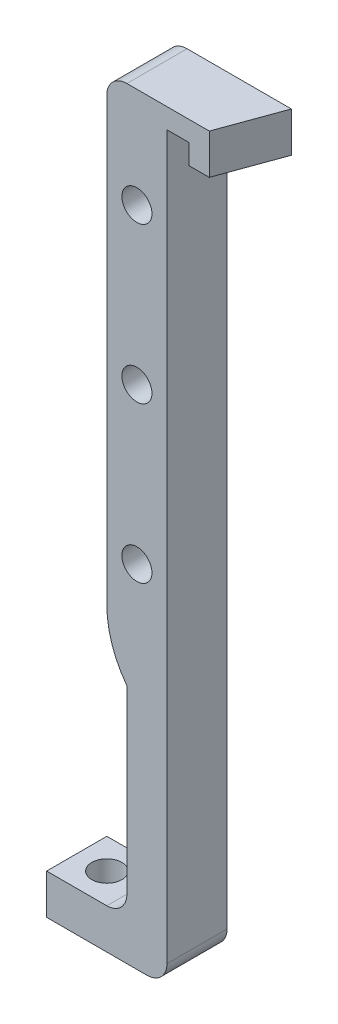
ISO-10303-21;
HEADER;
FILE_DESCRIPTION(('STEP AP214'),'2;1');
FILE_NAME('part.step','',(''),(''),'','','');
FILE_SCHEMA(('AUTOMOTIVE_DESIGN { 1 0 10303 214 1 1 1 1 }'));
ENDSEC;
DATA;
#1=APPLICATION_CONTEXT('core data for automotive mechanical design processes');
#2=APPLICATION_PROTOCOL_DEFINITION('international standard','automotive_design',2000,#1);
#3=PRODUCT_CONTEXT('',#1,'mechanical');
#4=PRODUCT('Part','Part','',(#3));
#5=PRODUCT_RELATED_PRODUCT_CATEGORY('part','',(#4));
#6=PRODUCT_DEFINITION_FORMATION('','',#4);
#7=PRODUCT_DEFINITION_CONTEXT('part definition',#1,'design');
#8=PRODUCT_DEFINITION('design','',#6,#7);
#9=PRODUCT_DEFINITION_SHAPE('','',#8);
#10=(LENGTH_UNIT() NAMED_UNIT(*) SI_UNIT(.MILLI.,.METRE.));
#11=(NAMED_UNIT(*) PLANE_ANGLE_UNIT() SI_UNIT($,.RADIAN.));
#12=(NAMED_UNIT(*) SI_UNIT($,.STERADIAN.) SOLID_ANGLE_UNIT());
#13=UNCERTAINTY_MEASURE_WITH_UNIT(LENGTH_MEASURE(1.E-05),#10,'distance_accuracy_value','');
#14=(GEOMETRIC_REPRESENTATION_CONTEXT(3) GLOBAL_UNCERTAINTY_ASSIGNED_CONTEXT((#13)) GLOBAL_UNIT_ASSIGNED_CONTEXT((#10,
#11,#12)) REPRESENTATION_CONTEXT('',''));
#15=CARTESIAN_POINT('',(0.,0.,0.));
#16=DIRECTION('',(0.,0.,1.));
#17=DIRECTION('',(1.,0.,0.));
#18=AXIS2_PLACEMENT_3D('',#15,#16,#17);
#19=CARTESIAN_POINT('',(15.748,93.98,-15.24));
#20=DIRECTION('',(0.,1.,0.));
#21=DIRECTION('',(0.,0.,-1.));
#22=AXIS2_PLACEMENT_3D('',#19,#20,#21);
#23=PLANE('',#22);
#24=DIRECTION('',(-0.342020143325663,0.,0.93969262078591));
#25=VECTOR('',#24,1.);
#26=CARTESIAN_POINT('',(10.4345468148915,93.98,-7.62));
#27=LINE('',#26,#25);
#28=CARTESIAN_POINT('',(13.2079999999999,93.98,-15.24));
#29=VERTEX_POINT('',#28);
#30=CARTESIAN_POINT('',(10.4345468148915,93.98,-7.62));
#31=VERTEX_POINT('',#30);
#32=EDGE_CURVE('E183',#29,#31,#27,.T.);
#33=ORIENTED_EDGE('',*,*,#32,.T.);
#34=DIRECTION('',(-1.,0.,0.));
#35=VECTOR('',#34,1.);
#36=CARTESIAN_POINT('',(15.748,93.98,-7.62));
#37=LINE('',#36,#35);
#38=CARTESIAN_POINT('',(7.62,93.98,-7.62));
#39=VERTEX_POINT('',#38);
#40=EDGE_CURVE('E207',#31,#39,#37,.T.);
#41=ORIENTED_EDGE('',*,*,#40,.T.);
#42=DIRECTION('',(0.,0.,1.));
#43=VECTOR('',#42,1.);
#44=CARTESIAN_POINT('',(7.62,93.98,-15.24));
#45=LINE('',#44,#43);
#46=CARTESIAN_POINT('',(7.62,93.9799999999999,-15.24));
#47=VERTEX_POINT('',#46);
#48=EDGE_CURVE('E203',#47,#39,#45,.T.);
#49=ORIENTED_EDGE('',*,*,#48,.F.);
#50=DIRECTION('',(-1.,0.,0.));
#51=VECTOR('',#50,1.);
#52=CARTESIAN_POINT('',(15.748,93.98,-15.24));
#53=LINE('',#52,#51);
#54=EDGE_CURVE('E225',#29,#47,#53,.T.);
#55=ORIENTED_EDGE('',*,*,#54,.F.);
#56=EDGE_LOOP('',(#33,#41,#49,#55));
#57=FACE_BOUND('',#56,.T.);
#58=ADVANCED_FACE('F35',(#57),#23,.F.);
#59=CARTESIAN_POINT('',(7.62,0.,-15.24));
#60=DIRECTION('',(-1.,0.,0.));
#61=DIRECTION('',(0.,0.,-1.));
#62=AXIS2_PLACEMENT_3D('',#59,#60,#61);
#63=PLANE('',#62);
#64=DIRECTION('',(0.,-1.,0.));
#65=VECTOR('',#64,1.);
#66=CARTESIAN_POINT('',(7.62,0.,-15.24));
#67=LINE('',#66,#65);
#68=CARTESIAN_POINT('',(7.62,2.54,-15.24));
#69=VERTEX_POINT('',#68);
#70=EDGE_CURVE('E216',#47,#69,#67,.T.);
#71=ORIENTED_EDGE('',*,*,#70,.F.);
#72=ORIENTED_EDGE('',*,*,#48,.T.);
#73=DIRECTION('',(0.,1.,0.));
#74=VECTOR('',#73,1.);
#75=CARTESIAN_POINT('',(7.62,0.,-7.62));
#76=LINE('',#75,#74);
#77=CARTESIAN_POINT('',(7.62,2.54,-7.62));
#78=VERTEX_POINT('',#77);
#79=EDGE_CURVE('E243',#78,#39,#76,.T.);
#80=ORIENTED_EDGE('',*,*,#79,.F.);
#81=DIRECTION('',(0.,0.,1.));
#82=VECTOR('',#81,1.);
#83=CARTESIAN_POINT('',(7.62,2.54,-15.24));
#84=LINE('',#83,#82);
#85=EDGE_CURVE('E166',#69,#78,#84,.T.);
#86=ORIENTED_EDGE('',*,*,#85,.F.);
#87=EDGE_LOOP('',(#71,#72,#80,#86));
#88=FACE_BOUND('',#87,.T.);
#89=ADVANCED_FACE('F321',(#88),#63,.F.);
#90=CARTESIAN_POINT('',(7.62,0.,-15.24));
#91=DIRECTION('',(0.,0.,1.));
#92=DIRECTION('',(-1.,0.,0.));
#93=AXIS2_PLACEMENT_3D('',#90,#91,#92);
#94=PLANE('',#93);
#95=CARTESIAN_POINT('',(3.81,64.135,-15.24));
#96=DIRECTION('',(0.,0.,1.));
#97=DIRECTION('',(1.,0.,0.));
#98=AXIS2_PLACEMENT_3D('',#95,#96,#97);
#99=CIRCLE('',#98,1.905);
#100=CARTESIAN_POINT('',(5.715,64.135,-15.24));
#101=VERTEX_POINT('',#100);
#102=EDGE_CURVE('E289',#101,#101,#99,.T.);
#103=ORIENTED_EDGE('',*,*,#102,.T.);
#104=EDGE_LOOP('',(#103));
#105=FACE_BOUND('',#104,.T.);
#106=CARTESIAN_POINT('',(3.81,44.45,-15.24));
#107=DIRECTION('',(0.,0.,1.));
#108=DIRECTION('',(1.,0.,0.));
#109=AXIS2_PLACEMENT_3D('',#106,#107,#108);
#110=CIRCLE('',#109,1.905);
#111=CARTESIAN_POINT('',(5.715,44.45,-15.24));
#112=VERTEX_POINT('',#111);
#113=EDGE_CURVE('E280',#112,#112,#110,.T.);
#114=ORIENTED_EDGE('',*,*,#113,.T.);
#115=EDGE_LOOP('',(#114));
#116=FACE_BOUND('',#115,.T.);
#117=CARTESIAN_POINT('',(3.81,83.82,-15.24));
#118=DIRECTION('',(0.,0.,1.));
#119=DIRECTION('',(1.,0.,0.));
#120=AXIS2_PLACEMENT_3D('',#117,#118,#119);
#121=CIRCLE('',#120,1.90500000000001);
#122=CARTESIAN_POINT('',(5.71500000000001,83.82,-15.24));
#123=VERTEX_POINT('',#122);
#124=EDGE_CURVE('E277',#123,#123,#121,.T.);
#125=ORIENTED_EDGE('',*,*,#124,.T.);
#126=EDGE_LOOP('',(#125));
#127=FACE_BOUND('',#126,.T.);
#128=DIRECTION('',(-1.,0.,0.));
#129=VECTOR('',#128,1.);
#130=CARTESIAN_POINT('',(7.62,0.,-15.24));
#131=LINE('',#130,#129);
#132=CARTESIAN_POINT('',(5.08,0.,-15.24));
#133=VERTEX_POINT('',#132);
#134=CARTESIAN_POINT('',(-7.62,0.,-15.24));
#135=VERTEX_POINT('',#134);
#136=EDGE_CURVE('E249',#133,#135,#131,.T.);
#137=ORIENTED_EDGE('',*,*,#136,.T.);
#138=DIRECTION('',(0.,1.,0.));
#139=VECTOR('',#138,1.);
#140=CARTESIAN_POINT('',(-7.62,0.,-15.24));
#141=LINE('',#140,#139);
#142=CARTESIAN_POINT('',(-7.62,5.08,-15.24));
#143=VERTEX_POINT('',#142);
#144=EDGE_CURVE('E210',#135,#143,#141,.T.);
#145=ORIENTED_EDGE('',*,*,#144,.T.);
#146=DIRECTION('',(1.,0.,0.));
#147=VECTOR('',#146,1.);
#148=CARTESIAN_POINT('',(-7.62,5.08,-15.24));
#149=LINE('',#148,#147);
#150=CARTESIAN_POINT('',(0.,5.08,-15.24));
#151=VERTEX_POINT('',#150);
#152=EDGE_CURVE('E253',#143,#151,#149,.T.);
#153=ORIENTED_EDGE('',*,*,#152,.T.);
#154=CARTESIAN_POINT('',(0.,7.62,-15.24));
#155=DIRECTION('',(0.,0.,-1.));
#156=DIRECTION('',(-1.,0.,0.));
#157=AXIS2_PLACEMENT_3D('',#154,#155,#156);
#158=CIRCLE('',#157,2.54);
#159=CARTESIAN_POINT('',(2.54,7.62,-15.24));
#160=VERTEX_POINT('',#159);
#161=EDGE_CURVE('E44',#160,#151,#158,.T.);
#162=ORIENTED_EDGE('',*,*,#161,.F.);
#163=DIRECTION('',(0.,1.,0.));
#164=VECTOR('',#163,1.);
#165=CARTESIAN_POINT('',(2.54,5.08,-15.24));
#166=LINE('',#165,#164);
#167=CARTESIAN_POINT('',(2.54,30.48,-15.24));
#168=VERTEX_POINT('',#167);
#169=EDGE_CURVE('E150',#160,#168,#166,.T.);
#170=ORIENTED_EDGE('',*,*,#169,.T.);
#171=CARTESIAN_POINT('',(12.7,38.1,-15.24));
#172=DIRECTION('',(0.,0.,-1.));
#173=DIRECTION('',(-1.,0.,0.));
#174=AXIS2_PLACEMENT_3D('',#171,#172,#173);
#175=CIRCLE('',#174,12.7);
#176=CARTESIAN_POINT('',(0.,38.1,-15.24));
#177=VERTEX_POINT('',#176);
#178=EDGE_CURVE('E160',#177,#168,#175,.F.);
#179=ORIENTED_EDGE('',*,*,#178,.F.);
#180=DIRECTION('',(0.,-1.,0.));
#181=VECTOR('',#180,1.);
#182=CARTESIAN_POINT('',(0.,0.,-15.24));
#183=LINE('',#182,#181);
#184=CARTESIAN_POINT('',(0.,93.98,-15.24));
#185=VERTEX_POINT('',#184);
#186=EDGE_CURVE('E232',#185,#177,#183,.T.);
#187=ORIENTED_EDGE('',*,*,#186,.F.);
#188=CARTESIAN_POINT('',(2.54,93.98,-15.24));
#189=DIRECTION('',(0.,0.,-1.));
#190=DIRECTION('',(-1.,0.,0.));
#191=AXIS2_PLACEMENT_3D('',#188,#189,#190);
#192=CIRCLE('',#191,2.54);
#193=CARTESIAN_POINT('',(2.54,96.52,-15.24));
#194=VERTEX_POINT('',#193);
#195=EDGE_CURVE('E265',#194,#185,#192,.F.);
#196=ORIENTED_EDGE('',*,*,#195,.F.);
#197=DIRECTION('',(-1.,0.,0.));
#198=VECTOR('',#197,1.);
#199=CARTESIAN_POINT('',(7.62,96.52,-15.24));
#200=LINE('',#199,#198);
#201=CARTESIAN_POINT('',(15.748,96.52,-15.24));
#202=VERTEX_POINT('',#201);
#203=EDGE_CURVE('E240',#202,#194,#200,.T.);
#204=ORIENTED_EDGE('',*,*,#203,.F.);
#205=DIRECTION('',(0.,-1.,0.));
#206=VECTOR('',#205,1.);
#207=CARTESIAN_POINT('',(15.748,96.52,-15.24));
#208=LINE('',#207,#206);
#209=CARTESIAN_POINT('',(15.748,91.44,-15.24));
#210=VERTEX_POINT('',#209);
#211=EDGE_CURVE('E204',#202,#210,#208,.T.);
#212=ORIENTED_EDGE('',*,*,#211,.T.);
#213=DIRECTION('',(-1.,0.,0.));
#214=VECTOR('',#213,1.);
#215=CARTESIAN_POINT('',(15.748,91.44,-15.24));
#216=LINE('',#215,#214);
#217=CARTESIAN_POINT('',(13.2079999999999,91.44,-15.24));
#218=VERTEX_POINT('',#217);
#219=EDGE_CURVE('E184',#210,#218,#216,.T.);
#220=ORIENTED_EDGE('',*,*,#219,.T.);
#221=DIRECTION('',(0.,1.,0.));
#222=VECTOR('',#221,1.);
#223=CARTESIAN_POINT('',(13.2079999999999,91.44,-15.24));
#224=LINE('',#223,#222);
#225=EDGE_CURVE('E201',#218,#29,#224,.T.);
#226=ORIENTED_EDGE('',*,*,#225,.T.);
#227=ORIENTED_EDGE('',*,*,#54,.T.);
#228=ORIENTED_EDGE('',*,*,#70,.T.);
#229=CARTESIAN_POINT('',(5.08,2.54,-15.24));
#230=DIRECTION('',(0.,0.,-1.));
#231=DIRECTION('',(-1.,0.,0.));
#232=AXIS2_PLACEMENT_3D('',#229,#230,#231);
#233=CIRCLE('',#232,2.54);
#234=EDGE_CURVE('E267',#133,#69,#233,.F.);
#235=ORIENTED_EDGE('',*,*,#234,.F.);
#236=EDGE_LOOP('',(#137,#145,#153,#162,#170,#179,#187,#196,#204,#212,#220,#226,#227,#228,#235));
#237=FACE_BOUND('',#236,.T.);
#238=ADVANCED_FACE('F169',(#105,#116,#127,#237),#94,.F.);
#239=CARTESIAN_POINT('',(7.62,0.,-15.24));
#240=DIRECTION('',(0.,1.,0.));
#241=DIRECTION('',(0.,0.,-1.));
#242=AXIS2_PLACEMENT_3D('',#239,#240,#241);
#243=PLANE('',#242);
#244=CARTESIAN_POINT('',(-3.81,0.,-11.43));
#245=DIRECTION('',(0.,-1.,0.));
#246=DIRECTION('',(0.,0.,-1.));
#247=AXIS2_PLACEMENT_3D('',#244,#245,#246);
#248=CIRCLE('',#247,1.89865);
#249=CARTESIAN_POINT('',(-3.81,0.,-13.32865));
#250=VERTEX_POINT('',#249);
#251=EDGE_CURVE('E180',#250,#250,#248,.T.);
#252=ORIENTED_EDGE('',*,*,#251,.F.);
#253=EDGE_LOOP('',(#252));
#254=FACE_BOUND('',#253,.T.);
#255=DIRECTION('',(-1.,0.,0.));
#256=VECTOR('',#255,1.);
#257=CARTESIAN_POINT('',(7.62,0.,-7.62));
#258=LINE('',#257,#256);
#259=CARTESIAN_POINT('',(5.08,0.,-7.62));
#260=VERTEX_POINT('',#259);
#261=CARTESIAN_POINT('',(-7.62,0.,-7.62));
#262=VERTEX_POINT('',#261);
#263=EDGE_CURVE('E246',#260,#262,#258,.T.);
#264=ORIENTED_EDGE('',*,*,#263,.T.);
#265=DIRECTION('',(0.,0.,-1.));
#266=VECTOR('',#265,1.);
#267=CARTESIAN_POINT('',(-7.62,0.,-15.24));
#268=LINE('',#267,#266);
#269=EDGE_CURVE('E254',#262,#135,#268,.T.);
#270=ORIENTED_EDGE('',*,*,#269,.T.);
#271=ORIENTED_EDGE('',*,*,#136,.F.);
#272=DIRECTION('',(0.,0.,1.));
#273=VECTOR('',#272,1.);
#274=CARTESIAN_POINT('',(5.08,0.,-15.24));
#275=LINE('',#274,#273);
#276=EDGE_CURVE('E263',#260,#133,#275,.F.);
#277=ORIENTED_EDGE('',*,*,#276,.F.);
#278=EDGE_LOOP('',(#264,#270,#271,#277));
#279=FACE_BOUND('',#278,.T.);
#280=ADVANCED_FACE('F306',(#254,#279),#243,.F.);
#281=CARTESIAN_POINT('',(7.62,0.,-7.62));
#282=DIRECTION('',(0.,0.,-1.));
#283=DIRECTION('',(1.,0.,0.));
#284=AXIS2_PLACEMENT_3D('',#281,#282,#283);
#285=PLANE('',#284);
#286=CARTESIAN_POINT('',(3.81,64.135,-7.62));
#287=DIRECTION('',(0.,0.,1.));
#288=DIRECTION('',(1.,0.,0.));
#289=AXIS2_PLACEMENT_3D('',#286,#287,#288);
#290=CIRCLE('',#289,1.905);
#291=CARTESIAN_POINT('',(5.715,64.135,-7.62));
#292=VERTEX_POINT('',#291);
#293=EDGE_CURVE('E39',#292,#292,#290,.T.);
#294=ORIENTED_EDGE('',*,*,#293,.F.);
#295=EDGE_LOOP('',(#294));
#296=FACE_BOUND('',#295,.T.);
#297=CARTESIAN_POINT('',(3.81,44.45,-7.62));
#298=DIRECTION('',(0.,0.,1.));
#299=DIRECTION('',(1.,0.,0.));
#300=AXIS2_PLACEMENT_3D('',#297,#298,#299);
#301=CIRCLE('',#300,1.905);
#302=CARTESIAN_POINT('',(5.715,44.45,-7.62));
#303=VERTEX_POINT('',#302);
#304=EDGE_CURVE('E278',#303,#303,#301,.T.);
#305=ORIENTED_EDGE('',*,*,#304,.F.);
#306=EDGE_LOOP('',(#305));
#307=FACE_BOUND('',#306,.T.);
#308=CARTESIAN_POINT('',(3.81,83.82,-7.62));
#309=DIRECTION('',(0.,0.,1.));
#310=DIRECTION('',(1.,0.,0.));
#311=AXIS2_PLACEMENT_3D('',#308,#309,#310);
#312=CIRCLE('',#311,1.90500000000001);
#313=CARTESIAN_POINT('',(5.71500000000001,83.82,-7.62));
#314=VERTEX_POINT('',#313);
#315=EDGE_CURVE('E172',#314,#314,#312,.T.);
#316=ORIENTED_EDGE('',*,*,#315,.F.);
#317=EDGE_LOOP('',(#316));
#318=FACE_BOUND('',#317,.T.);
#319=ORIENTED_EDGE('',*,*,#79,.T.);
#320=ORIENTED_EDGE('',*,*,#40,.F.);
#321=DIRECTION('',(0.,1.,0.));
#322=VECTOR('',#321,1.);
#323=CARTESIAN_POINT('',(10.4345468148915,91.44,-7.62));
#324=LINE('',#323,#322);
#325=CARTESIAN_POINT('',(10.4345468148915,91.44,-7.62));
#326=VERTEX_POINT('',#325);
#327=EDGE_CURVE('E199',#326,#31,#324,.T.);
#328=ORIENTED_EDGE('',*,*,#327,.F.);
#329=DIRECTION('',(1.,0.,0.));
#330=VECTOR('',#329,1.);
#331=CARTESIAN_POINT('',(10.4345468148915,91.44,-7.62));
#332=LINE('',#331,#330);
#333=CARTESIAN_POINT('',(12.9745468148915,91.44,-7.62));
#334=VERTEX_POINT('',#333);
#335=EDGE_CURVE('E189',#326,#334,#332,.T.);
#336=ORIENTED_EDGE('',*,*,#335,.T.);
#337=DIRECTION('',(0.,1.,0.));
#338=VECTOR('',#337,1.);
#339=CARTESIAN_POINT('',(12.9745468148915,91.44,-7.62));
#340=LINE('',#339,#338);
#341=CARTESIAN_POINT('',(12.9745468148915,96.52,-7.62));
#342=VERTEX_POINT('',#341);
#343=EDGE_CURVE('E194',#334,#342,#340,.T.);
#344=ORIENTED_EDGE('',*,*,#343,.T.);
#345=DIRECTION('',(-1.,0.,0.));
#346=VECTOR('',#345,1.);
#347=CARTESIAN_POINT('',(7.62,96.52,-7.62));
#348=LINE('',#347,#346);
#349=CARTESIAN_POINT('',(2.54,96.52,-7.62));
#350=VERTEX_POINT('',#349);
#351=EDGE_CURVE('E242',#342,#350,#348,.T.);
#352=ORIENTED_EDGE('',*,*,#351,.T.);
#353=CARTESIAN_POINT('',(2.54,93.98,-7.62));
#354=DIRECTION('',(0.,0.,1.));
#355=DIRECTION('',(1.,0.,0.));
#356=AXIS2_PLACEMENT_3D('',#353,#354,#355);
#357=CIRCLE('',#356,2.54);
#358=CARTESIAN_POINT('',(0.,93.98,-7.62));
#359=VERTEX_POINT('',#358);
#360=EDGE_CURVE('E342',#359,#350,#357,.F.);
#361=ORIENTED_EDGE('',*,*,#360,.F.);
#362=DIRECTION('',(0.,1.,0.));
#363=VECTOR('',#362,1.);
#364=CARTESIAN_POINT('',(0.,0.,-7.62));
#365=LINE('',#364,#363);
#366=CARTESIAN_POINT('',(0.,38.1,-7.62));
#367=VERTEX_POINT('',#366);
#368=EDGE_CURVE('E228',#367,#359,#365,.T.);
#369=ORIENTED_EDGE('',*,*,#368,.F.);
#370=CARTESIAN_POINT('',(12.7,38.1,-7.62));
#371=DIRECTION('',(0.,0.,1.));
#372=DIRECTION('',(1.,0.,0.));
#373=AXIS2_PLACEMENT_3D('',#370,#371,#372);
#374=CIRCLE('',#373,12.7);
#375=CARTESIAN_POINT('',(2.54,30.48,-7.62));
#376=VERTEX_POINT('',#375);
#377=EDGE_CURVE('E233',#376,#367,#374,.F.);
#378=ORIENTED_EDGE('',*,*,#377,.F.);
#379=DIRECTION('',(0.,-1.,0.));
#380=VECTOR('',#379,1.);
#381=CARTESIAN_POINT('',(2.54,5.08,-7.62));
#382=LINE('',#381,#380);
#383=CARTESIAN_POINT('',(2.54,7.62,-7.62));
#384=VERTEX_POINT('',#383);
#385=EDGE_CURVE('E153',#376,#384,#382,.T.);
#386=ORIENTED_EDGE('',*,*,#385,.T.);
#387=CARTESIAN_POINT('',(0.,7.62,-7.62));
#388=DIRECTION('',(0.,0.,1.));
#389=DIRECTION('',(1.,0.,0.));
#390=AXIS2_PLACEMENT_3D('',#387,#388,#389);
#391=CIRCLE('',#390,2.54);
#392=CARTESIAN_POINT('',(0.,5.08,-7.62));
#393=VERTEX_POINT('',#392);
#394=EDGE_CURVE('E11',#393,#384,#391,.T.);
#395=ORIENTED_EDGE('',*,*,#394,.F.);
#396=DIRECTION('',(1.,0.,0.));
#397=VECTOR('',#396,1.);
#398=CARTESIAN_POINT('',(-7.62,5.08,-7.62));
#399=LINE('',#398,#397);
#400=CARTESIAN_POINT('',(-7.62,5.08,-7.62));
#401=VERTEX_POINT('',#400);
#402=EDGE_CURVE('E251',#401,#393,#399,.T.);
#403=ORIENTED_EDGE('',*,*,#402,.F.);
#404=DIRECTION('',(0.,-1.,0.));
#405=VECTOR('',#404,1.);
#406=CARTESIAN_POINT('',(-7.62,0.,-7.62));
#407=LINE('',#406,#405);
#408=EDGE_CURVE('E349',#401,#262,#407,.T.);
#409=ORIENTED_EDGE('',*,*,#408,.T.);
#410=ORIENTED_EDGE('',*,*,#263,.F.);
#411=CARTESIAN_POINT('',(5.08,2.54,-7.62));
#412=DIRECTION('',(0.,0.,1.));
#413=DIRECTION('',(1.,0.,0.));
#414=AXIS2_PLACEMENT_3D('',#411,#412,#413);
#415=CIRCLE('',#414,2.54);
#416=EDGE_CURVE('E315',#78,#260,#415,.F.);
#417=ORIENTED_EDGE('',*,*,#416,.F.);
#418=EDGE_LOOP('',(#319,#320,#328,#336,#344,#352,#361,#369,#378,#386,#395,#403,#409,#410,#417));
#419=FACE_BOUND('',#418,.T.);
#420=ADVANCED_FACE('F302',(#296,#307,#318,#419),#285,.F.);
#421=CARTESIAN_POINT('',(7.62,96.52,-15.24));
#422=DIRECTION('',(0.,-1.,0.));
#423=DIRECTION('',(0.,0.,1.));
#424=AXIS2_PLACEMENT_3D('',#421,#422,#423);
#425=PLANE('',#424);
#426=ORIENTED_EDGE('',*,*,#351,.F.);
#427=DIRECTION('',(-0.342020143325669,0.,0.939692620785908));
#428=VECTOR('',#427,1.);
#429=CARTESIAN_POINT('',(12.9745468148915,96.52,-7.62));
#430=LINE('',#429,#428);
#431=EDGE_CURVE('E157',#202,#342,#430,.T.);
#432=ORIENTED_EDGE('',*,*,#431,.F.);
#433=ORIENTED_EDGE('',*,*,#203,.T.);
#434=DIRECTION('',(0.,0.,-1.));
#435=VECTOR('',#434,1.);
#436=CARTESIAN_POINT('',(2.54,96.52,-15.24));
#437=LINE('',#436,#435);
#438=EDGE_CURVE('E52',#350,#194,#437,.T.);
#439=ORIENTED_EDGE('',*,*,#438,.F.);
#440=EDGE_LOOP('',(#426,#432,#433,#439));
#441=FACE_BOUND('',#440,.T.);
#442=ADVANCED_FACE('F305',(#441),#425,.F.);
#443=CARTESIAN_POINT('',(0.,0.,-15.24));
#444=DIRECTION('',(-1.,0.,0.));
#445=DIRECTION('',(0.,0.,-1.));
#446=AXIS2_PLACEMENT_3D('',#443,#444,#445);
#447=PLANE('',#446);
#448=ORIENTED_EDGE('',*,*,#186,.T.);
#449=DIRECTION('',(0.,0.,-1.));
#450=VECTOR('',#449,1.);
#451=CARTESIAN_POINT('',(0.,38.1,-15.24));
#452=LINE('',#451,#450);
#453=EDGE_CURVE('E162',#367,#177,#452,.T.);
#454=ORIENTED_EDGE('',*,*,#453,.F.);
#455=ORIENTED_EDGE('',*,*,#368,.T.);
#456=DIRECTION('',(0.,0.,-1.));
#457=VECTOR('',#456,1.);
#458=CARTESIAN_POINT('',(0.,93.98,-7.62));
#459=LINE('',#458,#457);
#460=EDGE_CURVE('E270',#185,#359,#459,.F.);
#461=ORIENTED_EDGE('',*,*,#460,.F.);
#462=EDGE_LOOP('',(#448,#454,#455,#461));
#463=FACE_BOUND('',#462,.T.);
#464=ADVANCED_FACE('F361',(#463),#447,.T.);
#465=CARTESIAN_POINT('',(-7.62,5.08,-15.24));
#466=DIRECTION('',(0.,-1.,0.));
#467=DIRECTION('',(0.,0.,1.));
#468=AXIS2_PLACEMENT_3D('',#465,#466,#467);
#469=PLANE('',#468);
#470=CARTESIAN_POINT('',(-3.81,5.08,-11.43));
#471=DIRECTION('',(0.,-1.,0.));
#472=DIRECTION('',(0.,0.,-1.));
#473=AXIS2_PLACEMENT_3D('',#470,#471,#472);
#474=CIRCLE('',#473,1.89865);
#475=CARTESIAN_POINT('',(-3.81,5.08,-13.32865));
#476=VERTEX_POINT('',#475);
#477=EDGE_CURVE('E177',#476,#476,#474,.T.);
#478=ORIENTED_EDGE('',*,*,#477,.T.);
#479=EDGE_LOOP('',(#478));
#480=FACE_BOUND('',#479,.T.);
#481=ORIENTED_EDGE('',*,*,#152,.F.);
#482=DIRECTION('',(0.,0.,1.));
#483=VECTOR('',#482,1.);
#484=CARTESIAN_POINT('',(-7.62,5.08,-15.24));
#485=LINE('',#484,#483);
#486=EDGE_CURVE('E350',#143,#401,#485,.T.);
#487=ORIENTED_EDGE('',*,*,#486,.T.);
#488=ORIENTED_EDGE('',*,*,#402,.T.);
#489=DIRECTION('',(0.,0.,-1.));
#490=VECTOR('',#489,1.);
#491=CARTESIAN_POINT('',(0.,5.08,-7.62));
#492=LINE('',#491,#490);
#493=EDGE_CURVE('E60',#151,#393,#492,.F.);
#494=ORIENTED_EDGE('',*,*,#493,.F.);
#495=EDGE_LOOP('',(#481,#487,#488,#494));
#496=FACE_BOUND('',#495,.T.);
#497=ADVANCED_FACE('F359',(#480,#496),#469,.F.);
#498=CARTESIAN_POINT('',(-7.62,0.,-15.24));
#499=DIRECTION('',(-1.,0.,0.));
#500=DIRECTION('',(0.,0.,-1.));
#501=AXIS2_PLACEMENT_3D('',#498,#499,#500);
#502=PLANE('',#501);
#503=ORIENTED_EDGE('',*,*,#144,.F.);
#504=ORIENTED_EDGE('',*,*,#269,.F.);
#505=ORIENTED_EDGE('',*,*,#408,.F.);
#506=ORIENTED_EDGE('',*,*,#486,.F.);
#507=EDGE_LOOP('',(#503,#504,#505,#506));
#508=FACE_BOUND('',#507,.T.);
#509=ADVANCED_FACE('F357',(#508),#502,.T.);
#510=CARTESIAN_POINT('',(10.4345468148915,91.44,-7.62));
#511=DIRECTION('',(0.939692620785911,0.,0.342020143325663));
#512=DIRECTION('',(-0.342020143325663,0.,0.939692620785911));
#513=AXIS2_PLACEMENT_3D('',#510,#511,#512);
#514=PLANE('',#513);
#515=ORIENTED_EDGE('',*,*,#32,.F.);
#516=ORIENTED_EDGE('',*,*,#225,.F.);
#517=DIRECTION('',(-0.342020143325663,0.,0.93969262078591));
#518=VECTOR('',#517,1.);
#519=CARTESIAN_POINT('',(10.4345468148915,91.44,-7.62));
#520=LINE('',#519,#518);
#521=EDGE_CURVE('E187',#218,#326,#520,.T.);
#522=ORIENTED_EDGE('',*,*,#521,.T.);
#523=ORIENTED_EDGE('',*,*,#327,.T.);
#524=EDGE_LOOP('',(#515,#516,#522,#523));
#525=FACE_BOUND('',#524,.T.);
#526=ADVANCED_FACE('F328',(#525),#514,.F.);
#527=CARTESIAN_POINT('',(15.748,91.44,-15.24));
#528=DIRECTION('',(-0.939692620785908,0.,-0.342020143325669));
#529=DIRECTION('',(0.342020143325669,0.,-0.939692620785908));
#530=AXIS2_PLACEMENT_3D('',#527,#528,#529);
#531=PLANE('',#530);
#532=ORIENTED_EDGE('',*,*,#343,.F.);
#533=DIRECTION('',(0.342020143325669,0.,-0.939692620785908));
#534=VECTOR('',#533,1.);
#535=CARTESIAN_POINT('',(15.748,91.44,-15.24));
#536=LINE('',#535,#534);
#537=EDGE_CURVE('E192',#334,#210,#536,.T.);
#538=ORIENTED_EDGE('',*,*,#537,.T.);
#539=ORIENTED_EDGE('',*,*,#211,.F.);
#540=ORIENTED_EDGE('',*,*,#431,.T.);
#541=EDGE_LOOP('',(#532,#538,#539,#540));
#542=FACE_BOUND('',#541,.T.);
#543=ADVANCED_FACE('F336',(#542),#531,.F.);
#544=CARTESIAN_POINT('',(0.,91.44,-15.24));
#545=DIRECTION('',(0.,1.,0.));
#546=DIRECTION('',(0.,0.,-1.));
#547=AXIS2_PLACEMENT_3D('',#544,#545,#546);
#548=PLANE('',#547);
#549=ORIENTED_EDGE('',*,*,#219,.F.);
#550=ORIENTED_EDGE('',*,*,#537,.F.);
#551=ORIENTED_EDGE('',*,*,#335,.F.);
#552=ORIENTED_EDGE('',*,*,#521,.F.);
#553=EDGE_LOOP('',(#549,#550,#551,#552));
#554=FACE_BOUND('',#553,.T.);
#555=ADVANCED_FACE('F333',(#554),#548,.F.);
#556=CARTESIAN_POINT('',(-3.81,5.08,-11.43));
#557=DIRECTION('',(0.,1.,0.));
#558=DIRECTION('',(0.,0.,-1.));
#559=AXIS2_PLACEMENT_3D('',#556,#557,#558);
#560=CYLINDRICAL_SURFACE('',#559,1.89865);
#561=ORIENTED_EDGE('',*,*,#251,.T.);
#562=EDGE_LOOP('',(#561));
#563=FACE_BOUND('',#562,.T.);
#564=ORIENTED_EDGE('',*,*,#477,.F.);
#565=EDGE_LOOP('',(#564));
#566=FACE_BOUND('',#565,.T.);
#567=ADVANCED_FACE('F383',(#563,#566),#560,.F.);
#568=CARTESIAN_POINT('',(2.54,0.,-15.24));
#569=DIRECTION('',(1.,0.,0.));
#570=DIRECTION('',(0.,0.,1.));
#571=AXIS2_PLACEMENT_3D('',#568,#569,#570);
#572=PLANE('',#571);
#573=ORIENTED_EDGE('',*,*,#385,.F.);
#574=DIRECTION('',(0.,0.,1.));
#575=VECTOR('',#574,1.);
#576=CARTESIAN_POINT('',(2.54,30.48,-7.62));
#577=LINE('',#576,#575);
#578=EDGE_CURVE('E146',#168,#376,#577,.T.);
#579=ORIENTED_EDGE('',*,*,#578,.F.);
#580=ORIENTED_EDGE('',*,*,#169,.F.);
#581=DIRECTION('',(0.,0.,-1.));
#582=VECTOR('',#581,1.);
#583=CARTESIAN_POINT('',(2.54,7.62,-15.24));
#584=LINE('',#583,#582);
#585=EDGE_CURVE('E272',#384,#160,#584,.T.);
#586=ORIENTED_EDGE('',*,*,#585,.F.);
#587=EDGE_LOOP('',(#573,#579,#580,#586));
#588=FACE_BOUND('',#587,.T.);
#589=ADVANCED_FACE('F148',(#588),#572,.F.);
#590=CARTESIAN_POINT('',(12.7,38.1,-7.62));
#591=DIRECTION('',(0.,0.,1.));
#592=DIRECTION('',(-1.,0.,0.));
#593=AXIS2_PLACEMENT_3D('',#590,#591,#592);
#594=CYLINDRICAL_SURFACE('',#593,12.7);
#595=ORIENTED_EDGE('',*,*,#178,.T.);
#596=ORIENTED_EDGE('',*,*,#578,.T.);
#597=ORIENTED_EDGE('',*,*,#377,.T.);
#598=ORIENTED_EDGE('',*,*,#453,.T.);
#599=EDGE_LOOP('',(#595,#596,#597,#598));
#600=FACE_BOUND('',#599,.T.);
#601=ADVANCED_FACE('F161',(#600),#594,.T.);
#602=CARTESIAN_POINT('',(5.08,2.54,-15.24));
#603=DIRECTION('',(0.,0.,1.));
#604=DIRECTION('',(-1.,0.,0.));
#605=AXIS2_PLACEMENT_3D('',#602,#603,#604);
#606=CYLINDRICAL_SURFACE('',#605,2.54);
#607=ORIENTED_EDGE('',*,*,#234,.T.);
#608=ORIENTED_EDGE('',*,*,#85,.T.);
#609=ORIENTED_EDGE('',*,*,#416,.T.);
#610=ORIENTED_EDGE('',*,*,#276,.T.);
#611=EDGE_LOOP('',(#607,#608,#609,#610));
#612=FACE_BOUND('',#611,.T.);
#613=ADVANCED_FACE('F427',(#612),#606,.T.);
#614=CARTESIAN_POINT('',(2.54,93.98,-15.24));
#615=DIRECTION('',(0.,0.,1.));
#616=DIRECTION('',(-1.,0.,0.));
#617=AXIS2_PLACEMENT_3D('',#614,#615,#616);
#618=CYLINDRICAL_SURFACE('',#617,2.54);
#619=ORIENTED_EDGE('',*,*,#360,.T.);
#620=ORIENTED_EDGE('',*,*,#438,.T.);
#621=ORIENTED_EDGE('',*,*,#195,.T.);
#622=ORIENTED_EDGE('',*,*,#460,.T.);
#623=EDGE_LOOP('',(#619,#620,#621,#622));
#624=FACE_BOUND('',#623,.T.);
#625=ADVANCED_FACE('F419',(#624),#618,.T.);
#626=CARTESIAN_POINT('',(0.,7.62,-15.24));
#627=DIRECTION('',(0.,0.,1.));
#628=DIRECTION('',(0.,1.,0.));
#629=AXIS2_PLACEMENT_3D('',#626,#627,#628);
#630=CYLINDRICAL_SURFACE('',#629,2.54);
#631=ORIENTED_EDGE('',*,*,#394,.T.);
#632=ORIENTED_EDGE('',*,*,#585,.T.);
#633=ORIENTED_EDGE('',*,*,#161,.T.);
#634=ORIENTED_EDGE('',*,*,#493,.T.);
#635=EDGE_LOOP('',(#631,#632,#633,#634));
#636=FACE_BOUND('',#635,.T.);
#637=ADVANCED_FACE('F37',(#636),#630,.F.);
#638=CARTESIAN_POINT('',(3.81,83.82,-7.61995));
#639=DIRECTION('',(0.,0.,-1.));
#640=DIRECTION('',(1.,0.,0.));
#641=AXIS2_PLACEMENT_3D('',#638,#639,#640);
#642=CYLINDRICAL_SURFACE('',#641,1.90500000000001);
#643=ORIENTED_EDGE('',*,*,#124,.F.);
#644=EDGE_LOOP('',(#643));
#645=FACE_BOUND('',#644,.T.);
#646=ORIENTED_EDGE('',*,*,#315,.T.);
#647=EDGE_LOOP('',(#646));
#648=FACE_BOUND('',#647,.T.);
#649=ADVANCED_FACE('F389',(#645,#648),#642,.F.);
#650=CARTESIAN_POINT('',(3.81,44.45,-7.61995));
#651=DIRECTION('',(0.,0.,-1.));
#652=DIRECTION('',(1.,0.,0.));
#653=AXIS2_PLACEMENT_3D('',#650,#651,#652);
#654=CYLINDRICAL_SURFACE('',#653,1.905);
#655=ORIENTED_EDGE('',*,*,#113,.F.);
#656=EDGE_LOOP('',(#655));
#657=FACE_BOUND('',#656,.T.);
#658=ORIENTED_EDGE('',*,*,#304,.T.);
#659=EDGE_LOOP('',(#658));
#660=FACE_BOUND('',#659,.T.);
#661=ADVANCED_FACE('F298',(#657,#660),#654,.F.);
#662=CARTESIAN_POINT('',(3.81,64.135,-7.61995));
#663=DIRECTION('',(0.,0.,-1.));
#664=DIRECTION('',(1.,0.,0.));
#665=AXIS2_PLACEMENT_3D('',#662,#663,#664);
#666=CYLINDRICAL_SURFACE('',#665,1.905);
#667=ORIENTED_EDGE('',*,*,#102,.F.);
#668=EDGE_LOOP('',(#667));
#669=FACE_BOUND('',#668,.T.);
#670=ORIENTED_EDGE('',*,*,#293,.T.);
#671=EDGE_LOOP('',(#670));
#672=FACE_BOUND('',#671,.T.);
#673=ADVANCED_FACE('F295',(#669,#672),#666,.F.);
#674=CLOSED_SHELL('',(#58,#89,#238,#280,#420,#442,#464,#497,#509,#526,#543,#555,#567,#589,#601,
#613,#625,#637,#649,#661,#673));
#675=MANIFOLD_SOLID_BREP('B2',#674);
#676=ADVANCED_BREP_SHAPE_REPRESENTATION('',(#18,#675),#14);
#677=SHAPE_DEFINITION_REPRESENTATION(#9,#676);
ENDSEC;
END-ISO-10303-21;
